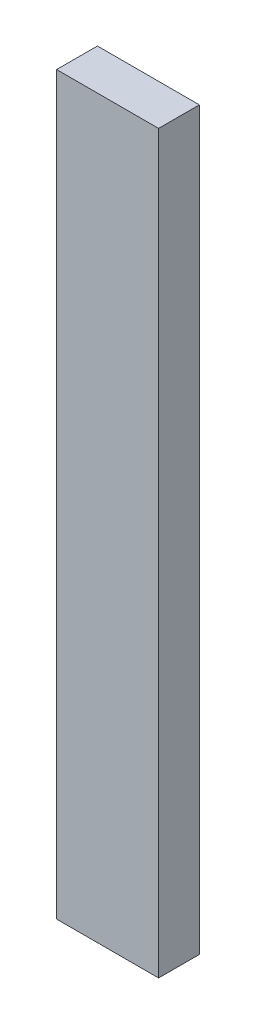
ISO-10303-21;
HEADER;
FILE_DESCRIPTION(('STEP AP214'),'2;1');
FILE_NAME('part.step','',(''),(''),'','','');
FILE_SCHEMA(('AUTOMOTIVE_DESIGN { 1 0 10303 214 1 1 1 1 }'));
ENDSEC;
DATA;
#1=APPLICATION_CONTEXT('core data for automotive mechanical design processes');
#2=APPLICATION_PROTOCOL_DEFINITION('international standard','automotive_design',2000,#1);
#3=PRODUCT_CONTEXT('',#1,'mechanical');
#4=PRODUCT('Part','Part','',(#3));
#5=PRODUCT_RELATED_PRODUCT_CATEGORY('part','',(#4));
#6=PRODUCT_DEFINITION_FORMATION('','',#4);
#7=PRODUCT_DEFINITION_CONTEXT('part definition',#1,'design');
#8=PRODUCT_DEFINITION('design','',#6,#7);
#9=PRODUCT_DEFINITION_SHAPE('','',#8);
#10=(LENGTH_UNIT() NAMED_UNIT(*) SI_UNIT(.MILLI.,.METRE.));
#11=(NAMED_UNIT(*) PLANE_ANGLE_UNIT() SI_UNIT($,.RADIAN.));
#12=(NAMED_UNIT(*) SI_UNIT($,.STERADIAN.) SOLID_ANGLE_UNIT());
#13=UNCERTAINTY_MEASURE_WITH_UNIT(LENGTH_MEASURE(1.E-05),#10,'distance_accuracy_value','');
#14=(GEOMETRIC_REPRESENTATION_CONTEXT(3) GLOBAL_UNCERTAINTY_ASSIGNED_CONTEXT((#13)) GLOBAL_UNIT_ASSIGNED_CONTEXT((#10,
#11,#12)) REPRESENTATION_CONTEXT('',''));
#15=CARTESIAN_POINT('',(0.,0.,0.));
#16=DIRECTION('',(0.,0.,1.));
#17=DIRECTION('',(1.,0.,0.));
#18=AXIS2_PLACEMENT_3D('',#15,#16,#17);
#19=CARTESIAN_POINT('',(0.,0.,0.1));
#20=DIRECTION('',(0.,0.,1.));
#21=DIRECTION('',(1.,0.,0.));
#22=AXIS2_PLACEMENT_3D('',#19,#20,#21);
#23=PLANE('',#22);
#24=DIRECTION('',(0.,-1.,0.));
#25=VECTOR('',#24,1.);
#26=CARTESIAN_POINT('',(-0.125,0.902303,0.1));
#27=LINE('',#26,#25);
#28=CARTESIAN_POINT('',(-0.125,0.902303,0.1));
#29=VERTEX_POINT('',#28);
#30=CARTESIAN_POINT('',(-0.125,-0.902303,0.1));
#31=VERTEX_POINT('',#30);
#32=EDGE_CURVE('E99',#29,#31,#27,.T.);
#33=ORIENTED_EDGE('',*,*,#32,.T.);
#34=DIRECTION('',(1.,0.,0.));
#35=VECTOR('',#34,1.);
#36=CARTESIAN_POINT('',(-0.125,-0.902303,0.1));
#37=LINE('',#36,#35);
#38=CARTESIAN_POINT('',(0.125,-0.902303,0.1));
#39=VERTEX_POINT('',#38);
#40=EDGE_CURVE('E70',#31,#39,#37,.T.);
#41=ORIENTED_EDGE('',*,*,#40,.T.);
#42=DIRECTION('',(0.,1.,0.));
#43=VECTOR('',#42,1.);
#44=CARTESIAN_POINT('',(0.125,-0.902303,0.1));
#45=LINE('',#44,#43);
#46=CARTESIAN_POINT('',(0.125,0.902303,0.1));
#47=VERTEX_POINT('',#46);
#48=EDGE_CURVE('E21',#39,#47,#45,.T.);
#49=ORIENTED_EDGE('',*,*,#48,.T.);
#50=DIRECTION('',(-1.,0.,0.));
#51=VECTOR('',#50,1.);
#52=CARTESIAN_POINT('',(0.125,0.902303,0.1));
#53=LINE('',#52,#51);
#54=EDGE_CURVE('E11',#47,#29,#53,.T.);
#55=ORIENTED_EDGE('',*,*,#54,.T.);
#56=EDGE_LOOP('',(#33,#41,#49,#55));
#57=FACE_BOUND('',#56,.T.);
#58=ADVANCED_FACE('F17',(#57),#23,.T.);
#59=CARTESIAN_POINT('',(0.,0.,0.));
#60=DIRECTION('',(0.,0.,1.));
#61=DIRECTION('',(1.,0.,0.));
#62=AXIS2_PLACEMENT_3D('',#59,#60,#61);
#63=PLANE('',#62);
#64=DIRECTION('',(0.,-1.,0.));
#65=VECTOR('',#64,1.);
#66=CARTESIAN_POINT('',(-0.125,0.902303,0.));
#67=LINE('',#66,#65);
#68=CARTESIAN_POINT('',(-0.125,0.902303,0.));
#69=VERTEX_POINT('',#68);
#70=CARTESIAN_POINT('',(-0.125,-0.902303,0.));
#71=VERTEX_POINT('',#70);
#72=EDGE_CURVE('E91',#69,#71,#67,.T.);
#73=ORIENTED_EDGE('',*,*,#72,.F.);
#74=DIRECTION('',(-1.,0.,0.));
#75=VECTOR('',#74,1.);
#76=CARTESIAN_POINT('',(0.125,0.902303,0.));
#77=LINE('',#76,#75);
#78=CARTESIAN_POINT('',(0.125,0.902303,0.));
#79=VERTEX_POINT('',#78);
#80=EDGE_CURVE('E27',#79,#69,#77,.T.);
#81=ORIENTED_EDGE('',*,*,#80,.F.);
#82=DIRECTION('',(0.,1.,0.));
#83=VECTOR('',#82,1.);
#84=CARTESIAN_POINT('',(0.125,-0.902303,0.));
#85=LINE('',#84,#83);
#86=CARTESIAN_POINT('',(0.125,-0.902303,0.));
#87=VERTEX_POINT('',#86);
#88=EDGE_CURVE('E60',#87,#79,#85,.T.);
#89=ORIENTED_EDGE('',*,*,#88,.F.);
#90=DIRECTION('',(1.,0.,0.));
#91=VECTOR('',#90,1.);
#92=CARTESIAN_POINT('',(-0.125,-0.902303,0.));
#93=LINE('',#92,#91);
#94=EDGE_CURVE('E76',#71,#87,#93,.T.);
#95=ORIENTED_EDGE('',*,*,#94,.F.);
#96=EDGE_LOOP('',(#73,#81,#89,#95));
#97=FACE_BOUND('',#96,.T.);
#98=ADVANCED_FACE('F19',(#97),#63,.F.);
#99=CARTESIAN_POINT('',(0.125,0.902303,0.));
#100=DIRECTION('',(0.,-1.,0.));
#101=DIRECTION('',(0.,0.,-1.));
#102=AXIS2_PLACEMENT_3D('',#99,#100,#101);
#103=PLANE('',#102);
#104=DIRECTION('',(0.,0.,1.));
#105=VECTOR('',#104,1.);
#106=CARTESIAN_POINT('',(0.125,0.902303,0.));
#107=LINE('',#106,#105);
#108=EDGE_CURVE('E87',#79,#47,#107,.T.);
#109=ORIENTED_EDGE('',*,*,#108,.F.);
#110=ORIENTED_EDGE('',*,*,#80,.T.);
#111=DIRECTION('',(0.,0.,1.));
#112=VECTOR('',#111,1.);
#113=CARTESIAN_POINT('',(-0.125,0.902303,0.));
#114=LINE('',#113,#112);
#115=EDGE_CURVE('E85',#69,#29,#114,.T.);
#116=ORIENTED_EDGE('',*,*,#115,.T.);
#117=ORIENTED_EDGE('',*,*,#54,.F.);
#118=EDGE_LOOP('',(#109,#110,#116,#117));
#119=FACE_BOUND('',#118,.T.);
#120=ADVANCED_FACE('F83',(#119),#103,.F.);
#121=CARTESIAN_POINT('',(0.125,-0.902303,0.));
#122=DIRECTION('',(-1.,0.,0.));
#123=DIRECTION('',(0.,0.,1.));
#124=AXIS2_PLACEMENT_3D('',#121,#122,#123);
#125=PLANE('',#124);
#126=DIRECTION('',(0.,0.,1.));
#127=VECTOR('',#126,1.);
#128=CARTESIAN_POINT('',(0.125,-0.902303,0.));
#129=LINE('',#128,#127);
#130=EDGE_CURVE('E110',#87,#39,#129,.T.);
#131=ORIENTED_EDGE('',*,*,#130,.F.);
#132=ORIENTED_EDGE('',*,*,#88,.T.);
#133=ORIENTED_EDGE('',*,*,#108,.T.);
#134=ORIENTED_EDGE('',*,*,#48,.F.);
#135=EDGE_LOOP('',(#131,#132,#133,#134));
#136=FACE_BOUND('',#135,.T.);
#137=ADVANCED_FACE('F123',(#136),#125,.F.);
#138=CARTESIAN_POINT('',(-0.125,-0.902303,0.));
#139=DIRECTION('',(0.,1.,0.));
#140=DIRECTION('',(1.,0.,0.));
#141=AXIS2_PLACEMENT_3D('',#138,#139,#140);
#142=PLANE('',#141);
#143=DIRECTION('',(0.,0.,1.));
#144=VECTOR('',#143,1.);
#145=CARTESIAN_POINT('',(-0.125,-0.902303,0.));
#146=LINE('',#145,#144);
#147=EDGE_CURVE('E95',#71,#31,#146,.T.);
#148=ORIENTED_EDGE('',*,*,#147,.F.);
#149=ORIENTED_EDGE('',*,*,#94,.T.);
#150=ORIENTED_EDGE('',*,*,#130,.T.);
#151=ORIENTED_EDGE('',*,*,#40,.F.);
#152=EDGE_LOOP('',(#148,#149,#150,#151));
#153=FACE_BOUND('',#152,.T.);
#154=ADVANCED_FACE('F124',(#153),#142,.F.);
#155=CARTESIAN_POINT('',(-0.125,0.902303,0.));
#156=DIRECTION('',(1.,0.,0.));
#157=DIRECTION('',(0.,1.,0.));
#158=AXIS2_PLACEMENT_3D('',#155,#156,#157);
#159=PLANE('',#158);
#160=ORIENTED_EDGE('',*,*,#115,.F.);
#161=ORIENTED_EDGE('',*,*,#72,.T.);
#162=ORIENTED_EDGE('',*,*,#147,.T.);
#163=ORIENTED_EDGE('',*,*,#32,.F.);
#164=EDGE_LOOP('',(#160,#161,#162,#163));
#165=FACE_BOUND('',#164,.T.);
#166=ADVANCED_FACE('F98',(#165),#159,.F.);
#167=CLOSED_SHELL('',(#58,#98,#120,#137,#154,#166));
#168=MANIFOLD_SOLID_BREP('B1',#167);
#169=ADVANCED_BREP_SHAPE_REPRESENTATION('',(#18,#168),#14);
#170=SHAPE_DEFINITION_REPRESENTATION(#9,#169);
ENDSEC;
END-ISO-10303-21;
